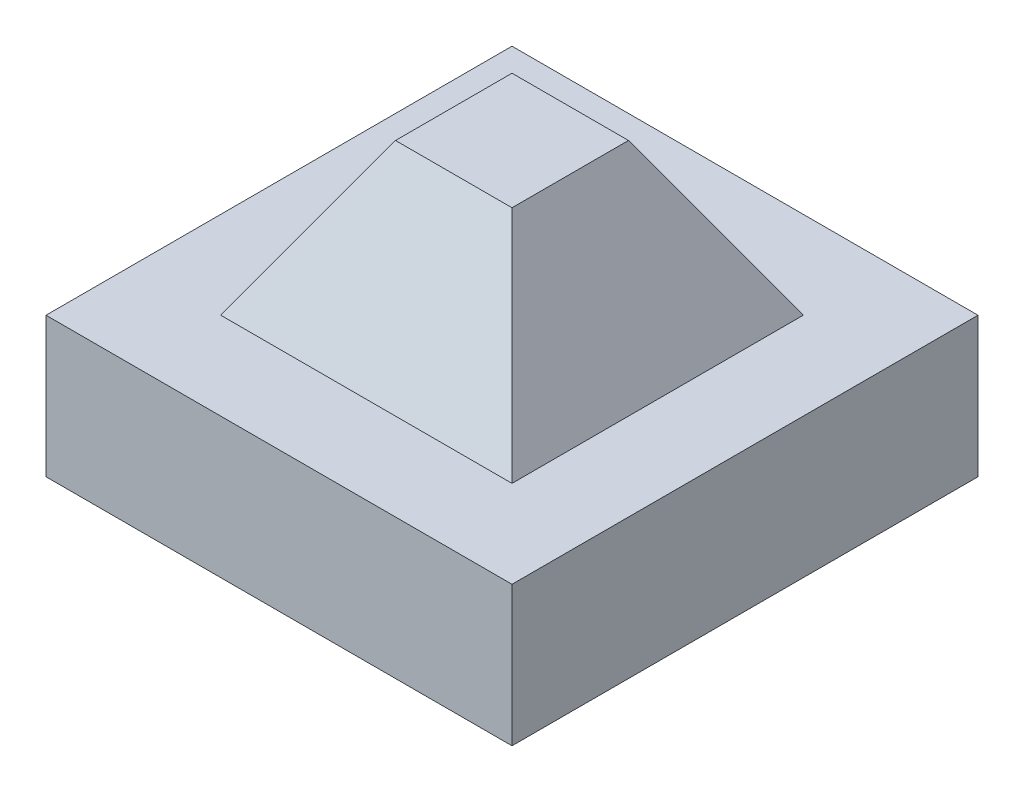
ISO-10303-21;
HEADER;
FILE_DESCRIPTION(('STEP AP214'),'2;1');
FILE_NAME('part.step','',(''),(''),'','','');
FILE_SCHEMA(('AUTOMOTIVE_DESIGN { 1 0 10303 214 1 1 1 1 }'));
ENDSEC;
DATA;
#1=APPLICATION_CONTEXT('core data for automotive mechanical design processes');
#2=APPLICATION_PROTOCOL_DEFINITION('international standard','automotive_design',2000,#1);
#3=PRODUCT_CONTEXT('',#1,'mechanical');
#4=PRODUCT('Part','Part','',(#3));
#5=PRODUCT_RELATED_PRODUCT_CATEGORY('part','',(#4));
#6=PRODUCT_DEFINITION_FORMATION('','',#4);
#7=PRODUCT_DEFINITION_CONTEXT('part definition',#1,'design');
#8=PRODUCT_DEFINITION('design','',#6,#7);
#9=PRODUCT_DEFINITION_SHAPE('','',#8);
#10=(LENGTH_UNIT() NAMED_UNIT(*) SI_UNIT(.MILLI.,.METRE.));
#11=(NAMED_UNIT(*) PLANE_ANGLE_UNIT() SI_UNIT($,.RADIAN.));
#12=(NAMED_UNIT(*) SI_UNIT($,.STERADIAN.) SOLID_ANGLE_UNIT());
#13=UNCERTAINTY_MEASURE_WITH_UNIT(LENGTH_MEASURE(1.E-05),#10,'distance_accuracy_value','');
#14=(GEOMETRIC_REPRESENTATION_CONTEXT(3) GLOBAL_UNCERTAINTY_ASSIGNED_CONTEXT((#13)) GLOBAL_UNIT_ASSIGNED_CONTEXT((#10,
#11,#12)) REPRESENTATION_CONTEXT('',''));
#15=CARTESIAN_POINT('',(0.,0.,0.));
#16=DIRECTION('',(0.,0.,1.));
#17=DIRECTION('',(1.,0.,0.));
#18=AXIS2_PLACEMENT_3D('',#15,#16,#17);
#19=CARTESIAN_POINT('',(400.,500.,400.));
#20=DIRECTION('',(-1.,0.,0.));
#21=DIRECTION('',(0.,0.,1.));
#22=AXIS2_PLACEMENT_3D('',#19,#20,#21);
#23=PLANE('',#22);
#24=DIRECTION('',(0.,0.,1.));
#25=VECTOR('',#24,1.);
#26=CARTESIAN_POINT('',(400.,240.192378864671,-400.));
#27=LINE('',#26,#25);
#28=CARTESIAN_POINT('',(400.,240.192378864671,-400.));
#29=VERTEX_POINT('',#28);
#30=CARTESIAN_POINT('',(400.,240.192378864671,400.));
#31=VERTEX_POINT('',#30);
#32=EDGE_CURVE('E122',#29,#31,#27,.T.);
#33=ORIENTED_EDGE('',*,*,#32,.T.);
#34=DIRECTION('',(0.,-1.,0.));
#35=VECTOR('',#34,1.);
#36=CARTESIAN_POINT('',(400.,500.,400.));
#37=LINE('',#36,#35);
#38=CARTESIAN_POINT('',(400.,0.,400.));
#39=VERTEX_POINT('',#38);
#40=EDGE_CURVE('E56',#31,#39,#37,.T.);
#41=ORIENTED_EDGE('',*,*,#40,.T.);
#42=DIRECTION('',(0.,0.,-1.));
#43=VECTOR('',#42,1.);
#44=CARTESIAN_POINT('',(400.,0.,400.));
#45=LINE('',#44,#43);
#46=CARTESIAN_POINT('',(400.,0.,-400.));
#47=VERTEX_POINT('',#46);
#48=EDGE_CURVE('E127',#39,#47,#45,.T.);
#49=ORIENTED_EDGE('',*,*,#48,.T.);
#50=DIRECTION('',(0.,-1.,0.));
#51=VECTOR('',#50,1.);
#52=CARTESIAN_POINT('',(400.,500.,-400.));
#53=LINE('',#52,#51);
#54=EDGE_CURVE('E142',#29,#47,#53,.T.);
#55=ORIENTED_EDGE('',*,*,#54,.F.);
#56=EDGE_LOOP('',(#33,#41,#49,#55));
#57=FACE_BOUND('',#56,.T.);
#58=ADVANCED_FACE('F34',(#57),#23,.F.);
#59=CARTESIAN_POINT('',(-400.,500.,-400.));
#60=DIRECTION('',(0.,0.,1.));
#61=DIRECTION('',(1.,0.,0.));
#62=AXIS2_PLACEMENT_3D('',#59,#60,#61);
#63=PLANE('',#62);
#64=DIRECTION('',(0.,-1.,0.));
#65=VECTOR('',#64,1.);
#66=CARTESIAN_POINT('',(-400.,500.,-400.));
#67=LINE('',#66,#65);
#68=CARTESIAN_POINT('',(-400.,240.192378864671,-400.));
#69=VERTEX_POINT('',#68);
#70=CARTESIAN_POINT('',(-400.,0.,-400.));
#71=VERTEX_POINT('',#70);
#72=EDGE_CURVE('E140',#69,#71,#67,.T.);
#73=ORIENTED_EDGE('',*,*,#72,.F.);
#74=DIRECTION('',(-1.,0.,0.));
#75=VECTOR('',#74,1.);
#76=CARTESIAN_POINT('',(400.,240.192378864671,-400.));
#77=LINE('',#76,#75);
#78=EDGE_CURVE('E162',#29,#69,#77,.T.);
#79=ORIENTED_EDGE('',*,*,#78,.F.);
#80=ORIENTED_EDGE('',*,*,#54,.T.);
#81=DIRECTION('',(-1.,0.,0.));
#82=VECTOR('',#81,1.);
#83=CARTESIAN_POINT('',(-400.,0.,-400.));
#84=LINE('',#83,#82);
#85=EDGE_CURVE('E129',#47,#71,#84,.T.);
#86=ORIENTED_EDGE('',*,*,#85,.T.);
#87=EDGE_LOOP('',(#73,#79,#80,#86));
#88=FACE_BOUND('',#87,.T.);
#89=ADVANCED_FACE('F173',(#88),#63,.F.);
#90=CARTESIAN_POINT('',(-400.,500.,400.));
#91=DIRECTION('',(1.,0.,0.));
#92=DIRECTION('',(0.,0.,-1.));
#93=AXIS2_PLACEMENT_3D('',#90,#91,#92);
#94=PLANE('',#93);
#95=DIRECTION('',(0.,-1.,0.));
#96=VECTOR('',#95,1.);
#97=CARTESIAN_POINT('',(-400.,500.,400.));
#98=LINE('',#97,#96);
#99=CARTESIAN_POINT('',(-400.,240.192378864671,400.));
#100=VERTEX_POINT('',#99);
#101=CARTESIAN_POINT('',(-400.,0.,400.));
#102=VERTEX_POINT('',#101);
#103=EDGE_CURVE('E138',#100,#102,#98,.T.);
#104=ORIENTED_EDGE('',*,*,#103,.F.);
#105=DIRECTION('',(0.,0.,-1.));
#106=VECTOR('',#105,1.);
#107=CARTESIAN_POINT('',(-400.,240.192378864671,400.));
#108=LINE('',#107,#106);
#109=EDGE_CURVE('E144',#100,#69,#108,.T.);
#110=ORIENTED_EDGE('',*,*,#109,.T.);
#111=ORIENTED_EDGE('',*,*,#72,.T.);
#112=DIRECTION('',(0.,0.,1.));
#113=VECTOR('',#112,1.);
#114=CARTESIAN_POINT('',(-400.,0.,400.));
#115=LINE('',#114,#113);
#116=EDGE_CURVE('E132',#71,#102,#115,.T.);
#117=ORIENTED_EDGE('',*,*,#116,.T.);
#118=EDGE_LOOP('',(#104,#110,#111,#117));
#119=FACE_BOUND('',#118,.T.);
#120=ADVANCED_FACE('F172',(#119),#94,.F.);
#121=CARTESIAN_POINT('',(-400.,500.,400.));
#122=DIRECTION('',(0.,0.,-1.));
#123=DIRECTION('',(-1.,0.,0.));
#124=AXIS2_PLACEMENT_3D('',#121,#122,#123);
#125=PLANE('',#124);
#126=ORIENTED_EDGE('',*,*,#40,.F.);
#127=DIRECTION('',(-1.,0.,0.));
#128=VECTOR('',#127,1.);
#129=CARTESIAN_POINT('',(400.,240.192378864671,400.));
#130=LINE('',#129,#128);
#131=EDGE_CURVE('E120',#31,#100,#130,.T.);
#132=ORIENTED_EDGE('',*,*,#131,.T.);
#133=ORIENTED_EDGE('',*,*,#103,.T.);
#134=DIRECTION('',(1.,0.,0.));
#135=VECTOR('',#134,1.);
#136=CARTESIAN_POINT('',(-400.,0.,400.));
#137=LINE('',#136,#135);
#138=EDGE_CURVE('E135',#102,#39,#137,.T.);
#139=ORIENTED_EDGE('',*,*,#138,.T.);
#140=EDGE_LOOP('',(#126,#132,#133,#139));
#141=FACE_BOUND('',#140,.T.);
#142=ADVANCED_FACE('F181',(#141),#125,.F.);
#143=CARTESIAN_POINT('',(0.,500.,0.));
#144=DIRECTION('',(0.,-1.,0.));
#145=DIRECTION('',(0.,0.,-1.));
#146=AXIS2_PLACEMENT_3D('',#143,#144,#145);
#147=PLANE('',#146);
#148=DIRECTION('',(-1.,0.,0.));
#149=VECTOR('',#148,1.);
#150=CARTESIAN_POINT('',(400.,500.,100.));
#151=LINE('',#150,#149);
#152=CARTESIAN_POINT('',(100.,500.,100.));
#153=VERTEX_POINT('',#152);
#154=CARTESIAN_POINT('',(-100.,500.,100.));
#155=VERTEX_POINT('',#154);
#156=EDGE_CURVE('E113',#153,#155,#151,.T.);
#157=ORIENTED_EDGE('',*,*,#156,.F.);
#158=DIRECTION('',(0.,0.,-1.));
#159=VECTOR('',#158,1.);
#160=CARTESIAN_POINT('',(100.,500.,400.));
#161=LINE('',#160,#159);
#162=CARTESIAN_POINT('',(100.,500.,-100.));
#163=VERTEX_POINT('',#162);
#164=EDGE_CURVE('E106',#153,#163,#161,.T.);
#165=ORIENTED_EDGE('',*,*,#164,.T.);
#166=DIRECTION('',(-1.,0.,0.));
#167=VECTOR('',#166,1.);
#168=CARTESIAN_POINT('',(400.,500.,-100.));
#169=LINE('',#168,#167);
#170=CARTESIAN_POINT('',(-100.,500.,-100.));
#171=VERTEX_POINT('',#170);
#172=EDGE_CURVE('E115',#163,#171,#169,.T.);
#173=ORIENTED_EDGE('',*,*,#172,.T.);
#174=DIRECTION('',(0.,0.,-1.));
#175=VECTOR('',#174,1.);
#176=CARTESIAN_POINT('',(-100.,500.,400.));
#177=LINE('',#176,#175);
#178=EDGE_CURVE('E48',#155,#171,#177,.T.);
#179=ORIENTED_EDGE('',*,*,#178,.F.);
#180=EDGE_LOOP('',(#157,#165,#173,#179));
#181=FACE_BOUND('',#180,.T.);
#182=ADVANCED_FACE('F111',(#181),#147,.F.);
#183=CARTESIAN_POINT('',(0.,0.,0.));
#184=DIRECTION('',(0.,-1.,0.));
#185=DIRECTION('',(0.,0.,-1.));
#186=AXIS2_PLACEMENT_3D('',#183,#184,#185);
#187=PLANE('',#186);
#188=ORIENTED_EDGE('',*,*,#48,.F.);
#189=ORIENTED_EDGE('',*,*,#138,.F.);
#190=ORIENTED_EDGE('',*,*,#116,.F.);
#191=ORIENTED_EDGE('',*,*,#85,.F.);
#192=EDGE_LOOP('',(#188,#189,#190,#191));
#193=FACE_BOUND('',#192,.T.);
#194=ADVANCED_FACE('F179',(#193),#187,.T.);
#195=CARTESIAN_POINT('',(400.,240.192378864671,250.));
#196=DIRECTION('',(0.,-0.500000000000004,-0.866025403784437));
#197=DIRECTION('',(0.,0.866025403784437,-0.500000000000004));
#198=AXIS2_PLACEMENT_3D('',#195,#196,#197);
#199=PLANE('',#198);
#200=DIRECTION('',(-1.,0.,0.));
#201=VECTOR('',#200,1.);
#202=CARTESIAN_POINT('',(400.,240.192378864671,250.));
#203=LINE('',#202,#201);
#204=CARTESIAN_POINT('',(250.,240.192378864671,250.));
#205=VERTEX_POINT('',#204);
#206=CARTESIAN_POINT('',(-250.,240.192378864671,250.));
#207=VERTEX_POINT('',#206);
#208=EDGE_CURVE('E119',#205,#207,#203,.T.);
#209=ORIENTED_EDGE('',*,*,#208,.F.);
#210=DIRECTION('',(-0.447213595499961,0.77459666924148,-0.447213595499961));
#211=VECTOR('',#210,1.);
#212=CARTESIAN_POINT('',(280.,188.230854637605,280.));
#213=LINE('',#212,#211);
#214=EDGE_CURVE('E105',#205,#153,#213,.T.);
#215=ORIENTED_EDGE('',*,*,#214,.T.);
#216=ORIENTED_EDGE('',*,*,#156,.T.);
#217=DIRECTION('',(-0.447213595499961,-0.77459666924148,0.447213595499961));
#218=VECTOR('',#217,1.);
#219=CARTESIAN_POINT('',(-119.999999999998,465.358983848626,119.999999999998));
#220=LINE('',#219,#218);
#221=EDGE_CURVE('E97',#155,#207,#220,.T.);
#222=ORIENTED_EDGE('',*,*,#221,.T.);
#223=EDGE_LOOP('',(#209,#215,#216,#222));
#224=FACE_BOUND('',#223,.T.);
#225=ADVANCED_FACE('F118',(#224),#199,.F.);
#226=CARTESIAN_POINT('',(400.,240.192378864671,-400.));
#227=DIRECTION('',(0.,-1.,0.));
#228=DIRECTION('',(0.,0.,-1.));
#229=AXIS2_PLACEMENT_3D('',#226,#227,#228);
#230=PLANE('',#229);
#231=DIRECTION('',(0.,0.,-1.));
#232=VECTOR('',#231,1.);
#233=CARTESIAN_POINT('',(250.,240.192378864671,400.));
#234=LINE('',#233,#232);
#235=CARTESIAN_POINT('',(250.,240.192378864671,-250.));
#236=VERTEX_POINT('',#235);
#237=EDGE_CURVE('E155',#205,#236,#234,.T.);
#238=ORIENTED_EDGE('',*,*,#237,.F.);
#239=ORIENTED_EDGE('',*,*,#208,.T.);
#240=DIRECTION('',(0.,0.,-1.));
#241=VECTOR('',#240,1.);
#242=CARTESIAN_POINT('',(-250.,240.192378864671,400.));
#243=LINE('',#242,#241);
#244=CARTESIAN_POINT('',(-250.,240.192378864671,-250.));
#245=VERTEX_POINT('',#244);
#246=EDGE_CURVE('E100',#207,#245,#243,.T.);
#247=ORIENTED_EDGE('',*,*,#246,.T.);
#248=DIRECTION('',(-1.,0.,0.));
#249=VECTOR('',#248,1.);
#250=CARTESIAN_POINT('',(400.,240.192378864671,-250.));
#251=LINE('',#250,#249);
#252=EDGE_CURVE('E150',#236,#245,#251,.T.);
#253=ORIENTED_EDGE('',*,*,#252,.F.);
#254=EDGE_LOOP('',(#238,#239,#247,#253));
#255=FACE_BOUND('',#254,.T.);
#256=ORIENTED_EDGE('',*,*,#109,.F.);
#257=ORIENTED_EDGE('',*,*,#131,.F.);
#258=ORIENTED_EDGE('',*,*,#32,.F.);
#259=ORIENTED_EDGE('',*,*,#78,.T.);
#260=EDGE_LOOP('',(#256,#257,#258,#259));
#261=FACE_BOUND('',#260,.T.);
#262=ADVANCED_FACE('F153',(#255,#261),#230,.F.);
#263=CARTESIAN_POINT('',(400.,240.192378864671,-250.));
#264=DIRECTION('',(0.,-0.500000000000004,0.866025403784436));
#265=DIRECTION('',(0.,-0.866025403784437,-0.500000000000004));
#266=AXIS2_PLACEMENT_3D('',#263,#264,#265);
#267=PLANE('',#266);
#268=ORIENTED_EDGE('',*,*,#172,.F.);
#269=DIRECTION('',(0.447213595499961,-0.77459666924148,-0.447213595499961));
#270=VECTOR('',#269,1.);
#271=CARTESIAN_POINT('',(280.,188.230854637605,-280.));
#272=LINE('',#271,#270);
#273=EDGE_CURVE('E11',#163,#236,#272,.T.);
#274=ORIENTED_EDGE('',*,*,#273,.T.);
#275=ORIENTED_EDGE('',*,*,#252,.T.);
#276=DIRECTION('',(0.447213595499961,0.77459666924148,0.447213595499961));
#277=VECTOR('',#276,1.);
#278=CARTESIAN_POINT('',(-119.999999999998,465.358983848626,-119.999999999998));
#279=LINE('',#278,#277);
#280=EDGE_CURVE('E41',#245,#171,#279,.T.);
#281=ORIENTED_EDGE('',*,*,#280,.T.);
#282=EDGE_LOOP('',(#268,#274,#275,#281));
#283=FACE_BOUND('',#282,.T.);
#284=ADVANCED_FACE('F148',(#283),#267,.F.);
#285=CARTESIAN_POINT('',(-250.,240.192378864671,400.));
#286=DIRECTION('',(0.866025403784436,-0.500000000000004,0.));
#287=DIRECTION('',(0.500000000000004,0.866025403784436,0.));
#288=AXIS2_PLACEMENT_3D('',#285,#286,#287);
#289=PLANE('',#288);
#290=ORIENTED_EDGE('',*,*,#178,.T.);
#291=ORIENTED_EDGE('',*,*,#280,.F.);
#292=ORIENTED_EDGE('',*,*,#246,.F.);
#293=ORIENTED_EDGE('',*,*,#221,.F.);
#294=EDGE_LOOP('',(#290,#291,#292,#293));
#295=FACE_BOUND('',#294,.T.);
#296=ADVANCED_FACE('F98',(#295),#289,.F.);
#297=CARTESIAN_POINT('',(250.,240.192378864671,400.));
#298=DIRECTION('',(-0.866025403784436,-0.500000000000004,0.));
#299=DIRECTION('',(0.500000000000004,-0.866025403784436,0.));
#300=AXIS2_PLACEMENT_3D('',#297,#298,#299);
#301=PLANE('',#300);
#302=ORIENTED_EDGE('',*,*,#237,.T.);
#303=ORIENTED_EDGE('',*,*,#273,.F.);
#304=ORIENTED_EDGE('',*,*,#164,.F.);
#305=ORIENTED_EDGE('',*,*,#214,.F.);
#306=EDGE_LOOP('',(#302,#303,#304,#305));
#307=FACE_BOUND('',#306,.T.);
#308=ADVANCED_FACE('F249',(#307),#301,.F.);
#309=CLOSED_SHELL('',(#58,#89,#120,#142,#182,#194,#225,#262,#284,#296,#308));
#310=MANIFOLD_SOLID_BREP('B2',#309);
#311=ADVANCED_BREP_SHAPE_REPRESENTATION('',(#18,#310),#14);
#312=SHAPE_DEFINITION_REPRESENTATION(#9,#311);
ENDSEC;
END-ISO-10303-21;
